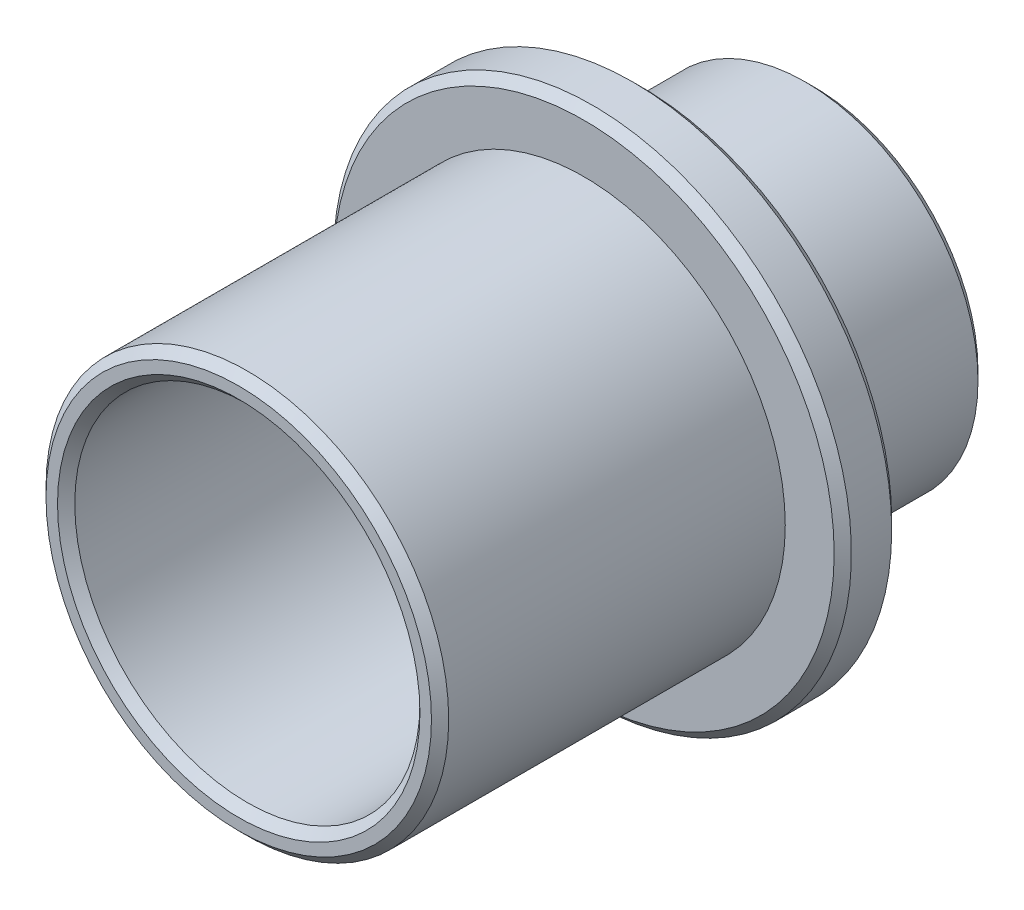
ISO-10303-21;
HEADER;
FILE_DESCRIPTION(('STEP AP214'),'2;1');
FILE_NAME('part.step','',(''),(''),'','','');
FILE_SCHEMA(('AUTOMOTIVE_DESIGN { 1 0 10303 214 1 1 1 1 }'));
ENDSEC;
DATA;
#1=APPLICATION_CONTEXT('core data for automotive mechanical design processes');
#2=APPLICATION_PROTOCOL_DEFINITION('international standard','automotive_design',2000,#1);
#3=PRODUCT_CONTEXT('',#1,'mechanical');
#4=PRODUCT('Part','Part','',(#3));
#5=PRODUCT_RELATED_PRODUCT_CATEGORY('part','',(#4));
#6=PRODUCT_DEFINITION_FORMATION('','',#4);
#7=PRODUCT_DEFINITION_CONTEXT('part definition',#1,'design');
#8=PRODUCT_DEFINITION('design','',#6,#7);
#9=PRODUCT_DEFINITION_SHAPE('','',#8);
#10=(LENGTH_UNIT() NAMED_UNIT(*) SI_UNIT(.MILLI.,.METRE.));
#11=(NAMED_UNIT(*) PLANE_ANGLE_UNIT() SI_UNIT($,.RADIAN.));
#12=(NAMED_UNIT(*) SI_UNIT($,.STERADIAN.) SOLID_ANGLE_UNIT());
#13=UNCERTAINTY_MEASURE_WITH_UNIT(LENGTH_MEASURE(1.E-05),#10,'distance_accuracy_value','');
#14=(GEOMETRIC_REPRESENTATION_CONTEXT(3) GLOBAL_UNCERTAINTY_ASSIGNED_CONTEXT((#13)) GLOBAL_UNIT_ASSIGNED_CONTEXT((#10,
#11,#12)) REPRESENTATION_CONTEXT('',''));
#15=CARTESIAN_POINT('',(0.,0.,0.));
#16=DIRECTION('',(0.,0.,1.));
#17=DIRECTION('',(1.,0.,0.));
#18=AXIS2_PLACEMENT_3D('',#15,#16,#17);
#19=CARTESIAN_POINT('',(0.,0.,0.));
#20=DIRECTION('',(0.,0.,-1.));
#21=DIRECTION('',(-1.,0.,0.));
#22=AXIS2_PLACEMENT_3D('',#19,#20,#21);
#23=PLANE('',#22);
#24=CARTESIAN_POINT('',(0.,0.,0.));
#25=DIRECTION('',(0.,0.,1.));
#26=DIRECTION('',(1.,0.,0.));
#27=AXIS2_PLACEMENT_3D('',#24,#25,#26);
#28=CIRCLE('',#27,4.);
#29=CARTESIAN_POINT('',(4.,0.,0.));
#30=VERTEX_POINT('',#29);
#31=EDGE_CURVE('E17',#30,#30,#28,.F.);
#32=ORIENTED_EDGE('',*,*,#31,.T.);
#33=EDGE_LOOP('',(#32));
#34=FACE_BOUND('',#33,.T.);
#35=ADVANCED_FACE('F14',(#34),#23,.T.);
#36=CARTESIAN_POINT('',(0.,0.,-6.));
#37=DIRECTION('',(0.,0.,1.));
#38=DIRECTION('',(1.,0.,0.));
#39=AXIS2_PLACEMENT_3D('',#36,#37,#38);
#40=CYLINDRICAL_SURFACE('',#39,4.);
#41=CARTESIAN_POINT('',(0.,0.,-5.69999999999027));
#42=DIRECTION('',(0.,0.,-1.));
#43=DIRECTION('',(-1.,0.,0.));
#44=AXIS2_PLACEMENT_3D('',#41,#42,#43);
#45=CIRCLE('',#44,4.0000000000191);
#46=CARTESIAN_POINT('',(-4.0000000000191,0.,-5.69999999999027));
#47=VERTEX_POINT('',#46);
#48=EDGE_CURVE('E35',#47,#47,#45,.T.);
#49=ORIENTED_EDGE('',*,*,#48,.T.);
#50=EDGE_LOOP('',(#49));
#51=FACE_BOUND('',#50,.T.);
#52=ORIENTED_EDGE('',*,*,#31,.F.);
#53=EDGE_LOOP('',(#52));
#54=FACE_BOUND('',#53,.T.);
#55=ADVANCED_FACE('F75',(#51,#54),#40,.F.);
#56=CARTESIAN_POINT('',(0.,0.,-5.99999999997181));
#57=DIRECTION('',(0.,0.,-1.));
#58=DIRECTION('',(-1.,0.,0.));
#59=AXIS2_PLACEMENT_3D('',#56,#57,#58);
#60=CONICAL_SURFACE('',#59,4.30000000000064,0.785398163397448);
#61=ORIENTED_EDGE('',*,*,#48,.F.);
#62=EDGE_LOOP('',(#61));
#63=FACE_BOUND('',#62,.T.);
#64=CARTESIAN_POINT('',(0.,0.,-5.99999999997181));
#65=DIRECTION('',(0.,0.,-1.));
#66=DIRECTION('',(-1.,0.,0.));
#67=AXIS2_PLACEMENT_3D('',#64,#65,#66);
#68=CIRCLE('',#67,4.30000000000064);
#69=CARTESIAN_POINT('',(-4.30000000000064,0.,-5.99999999997181));
#70=VERTEX_POINT('',#69);
#71=EDGE_CURVE('E64',#70,#70,#68,.F.);
#72=ORIENTED_EDGE('',*,*,#71,.F.);
#73=EDGE_LOOP('',(#72));
#74=FACE_BOUND('',#73,.T.);
#75=ADVANCED_FACE('F77',(#63,#74),#60,.F.);
#76=CARTESIAN_POINT('',(0.,0.,-6.));
#77=DIRECTION('',(0.,0.,-1.));
#78=DIRECTION('',(-1.,0.,0.));
#79=AXIS2_PLACEMENT_3D('',#76,#77,#78);
#80=PLANE('',#79);
#81=CARTESIAN_POINT('',(0.,0.,-5.99999999991496));
#82=DIRECTION('',(0.,0.,1.));
#83=DIRECTION('',(1.,0.,0.));
#84=AXIS2_PLACEMENT_3D('',#81,#82,#83);
#85=CIRCLE('',#84,5.70000000004711);
#86=CARTESIAN_POINT('',(5.70000000004711,0.,-5.99999999991496));
#87=VERTEX_POINT('',#86);
#88=EDGE_CURVE('E62',#87,#87,#85,.T.);
#89=ORIENTED_EDGE('',*,*,#88,.F.);
#90=EDGE_LOOP('',(#89));
#91=FACE_BOUND('',#90,.T.);
#92=ORIENTED_EDGE('',*,*,#71,.T.);
#93=EDGE_LOOP('',(#92));
#94=FACE_BOUND('',#93,.T.);
#95=ADVANCED_FACE('F83',(#91,#94),#80,.T.);
#96=CARTESIAN_POINT('',(0.,0.,-5.70000000010396));
#97=DIRECTION('',(0.,0.,1.));
#98=DIRECTION('',(1.,0.,0.));
#99=AXIS2_PLACEMENT_3D('',#96,#97,#98);
#100=CONICAL_SURFACE('',#99,5.99999999991496,0.785398163492187);
#101=CARTESIAN_POINT('',(0.,0.,-5.7));
#102=DIRECTION('',(0.,0.,1.));
#103=DIRECTION('',(1.,0.,0.));
#104=AXIS2_PLACEMENT_3D('',#101,#102,#103);
#105=CIRCLE('',#104,6.);
#106=CARTESIAN_POINT('',(6.,0.,-5.7));
#107=VERTEX_POINT('',#106);
#108=EDGE_CURVE('E61',#107,#107,#105,.T.);
#109=ORIENTED_EDGE('',*,*,#108,.F.);
#110=EDGE_LOOP('',(#109));
#111=FACE_BOUND('',#110,.T.);
#112=ORIENTED_EDGE('',*,*,#88,.T.);
#113=EDGE_LOOP('',(#112));
#114=FACE_BOUND('',#113,.T.);
#115=ADVANCED_FACE('F137',(#111,#114),#100,.T.);
#116=CARTESIAN_POINT('',(0.,0.,-6.));
#117=DIRECTION('',(0.,0.,1.));
#118=DIRECTION('',(1.,0.,0.));
#119=AXIS2_PLACEMENT_3D('',#116,#117,#118);
#120=CYLINDRICAL_SURFACE('',#119,6.);
#121=CARTESIAN_POINT('',(0.,0.,0.));
#122=DIRECTION('',(0.,0.,1.));
#123=DIRECTION('',(1.,0.,0.));
#124=AXIS2_PLACEMENT_3D('',#121,#122,#123);
#125=CIRCLE('',#124,6.);
#126=CARTESIAN_POINT('',(6.,0.,0.));
#127=VERTEX_POINT('',#126);
#128=EDGE_CURVE('E57',#127,#127,#125,.T.);
#129=ORIENTED_EDGE('',*,*,#128,.F.);
#130=EDGE_LOOP('',(#129));
#131=FACE_BOUND('',#130,.T.);
#132=ORIENTED_EDGE('',*,*,#108,.T.);
#133=EDGE_LOOP('',(#132));
#134=FACE_BOUND('',#133,.T.);
#135=ADVANCED_FACE('F133',(#131,#134),#120,.T.);
#136=CARTESIAN_POINT('',(0.,0.,2.));
#137=DIRECTION('',(0.,0.,-1.));
#138=DIRECTION('',(-1.,0.,0.));
#139=AXIS2_PLACEMENT_3D('',#136,#137,#138);
#140=PLANE('',#139);
#141=CARTESIAN_POINT('',(0.,0.,2.));
#142=DIRECTION('',(0.,0.,-1.));
#143=DIRECTION('',(-1.,0.,0.));
#144=AXIS2_PLACEMENT_3D('',#141,#142,#143);
#145=CIRCLE('',#144,6.);
#146=CARTESIAN_POINT('',(-6.,0.,2.));
#147=VERTEX_POINT('',#146);
#148=EDGE_CURVE('E54',#147,#147,#145,.F.);
#149=ORIENTED_EDGE('',*,*,#148,.T.);
#150=EDGE_LOOP('',(#149));
#151=FACE_BOUND('',#150,.T.);
#152=ADVANCED_FACE('F129',(#151),#140,.F.);
#153=CARTESIAN_POINT('',(0.,0.,0.));
#154=DIRECTION('',(0.,0.,-1.));
#155=DIRECTION('',(-1.,0.,0.));
#156=AXIS2_PLACEMENT_3D('',#153,#154,#155);
#157=PLANE('',#156);
#158=ORIENTED_EDGE('',*,*,#128,.T.);
#159=EDGE_LOOP('',(#158));
#160=FACE_BOUND('',#159,.T.);
#161=CARTESIAN_POINT('',(0.,0.,0.));
#162=DIRECTION('',(0.,0.,1.));
#163=DIRECTION('',(1.,0.,0.));
#164=AXIS2_PLACEMENT_3D('',#161,#162,#163);
#165=CIRCLE('',#164,8.69999999999999);
#166=CARTESIAN_POINT('',(8.69999999999999,0.,0.));
#167=VERTEX_POINT('',#166);
#168=EDGE_CURVE('E49',#167,#167,#165,.T.);
#169=ORIENTED_EDGE('',*,*,#168,.F.);
#170=EDGE_LOOP('',(#169));
#171=FACE_BOUND('',#170,.T.);
#172=ADVANCED_FACE('F125',(#160,#171),#157,.T.);
#173=CARTESIAN_POINT('',(0.,0.,14.));
#174=DIRECTION('',(0.,0.,-1.));
#175=DIRECTION('',(-1.,0.,0.));
#176=AXIS2_PLACEMENT_3D('',#173,#174,#175);
#177=CYLINDRICAL_SURFACE('',#176,6.);
#178=CARTESIAN_POINT('',(0.,0.,13.7000000000285));
#179=DIRECTION('',(0.,0.,1.));
#180=DIRECTION('',(1.,0.,0.));
#181=AXIS2_PLACEMENT_3D('',#178,#179,#180);
#182=CIRCLE('',#181,6.00000000002865);
#183=CARTESIAN_POINT('',(6.00000000002865,0.,13.7000000000285));
#184=VERTEX_POINT('',#183);
#185=EDGE_CURVE('E53',#184,#184,#182,.T.);
#186=ORIENTED_EDGE('',*,*,#185,.T.);
#187=EDGE_LOOP('',(#186));
#188=FACE_BOUND('',#187,.T.);
#189=ORIENTED_EDGE('',*,*,#148,.F.);
#190=EDGE_LOOP('',(#189));
#191=FACE_BOUND('',#190,.T.);
#192=ADVANCED_FACE('F122',(#188,#191),#177,.F.);
#193=CARTESIAN_POINT('',(0.,0.,0.300000000000007));
#194=DIRECTION('',(0.,0.,1.));
#195=DIRECTION('',(1.,0.,0.));
#196=AXIS2_PLACEMENT_3D('',#193,#194,#195);
#197=CONICAL_SURFACE('',#196,9.,0.785398163397454);
#198=ORIENTED_EDGE('',*,*,#168,.T.);
#199=EDGE_LOOP('',(#198));
#200=FACE_BOUND('',#199,.T.);
#201=CARTESIAN_POINT('',(0.,0.,0.300000000000007));
#202=DIRECTION('',(0.,0.,-1.));
#203=DIRECTION('',(-1.,0.,0.));
#204=AXIS2_PLACEMENT_3D('',#201,#202,#203);
#205=CIRCLE('',#204,9.);
#206=CARTESIAN_POINT('',(-9.,0.,0.300000000000007));
#207=VERTEX_POINT('',#206);
#208=EDGE_CURVE('E48',#207,#207,#205,.F.);
#209=ORIENTED_EDGE('',*,*,#208,.F.);
#210=EDGE_LOOP('',(#209));
#211=FACE_BOUND('',#210,.T.);
#212=ADVANCED_FACE('F118',(#200,#211),#197,.T.);
#213=CARTESIAN_POINT('',(0.,0.,14.00000000001));
#214=DIRECTION('',(0.,0.,1.));
#215=DIRECTION('',(1.,0.,0.));
#216=AXIS2_PLACEMENT_3D('',#213,#214,#215);
#217=CONICAL_SURFACE('',#216,6.30000000001019,0.785398163397448);
#218=ORIENTED_EDGE('',*,*,#185,.F.);
#219=EDGE_LOOP('',(#218));
#220=FACE_BOUND('',#219,.T.);
#221=CARTESIAN_POINT('',(0.,0.,14.00000000001));
#222=DIRECTION('',(0.,0.,1.));
#223=DIRECTION('',(1.,0.,0.));
#224=AXIS2_PLACEMENT_3D('',#221,#222,#223);
#225=CIRCLE('',#224,6.30000000001019);
#226=CARTESIAN_POINT('',(6.30000000001019,0.,14.00000000001));
#227=VERTEX_POINT('',#226);
#228=EDGE_CURVE('E44',#227,#227,#225,.F.);
#229=ORIENTED_EDGE('',*,*,#228,.F.);
#230=EDGE_LOOP('',(#229));
#231=FACE_BOUND('',#230,.T.);
#232=ADVANCED_FACE('F114',(#220,#231),#217,.F.);
#233=CARTESIAN_POINT('',(0.,0.,14.));
#234=DIRECTION('',(0.,0.,-1.));
#235=DIRECTION('',(-1.,0.,0.));
#236=AXIS2_PLACEMENT_3D('',#233,#234,#235);
#237=CYLINDRICAL_SURFACE('',#236,9.);
#238=CARTESIAN_POINT('',(0.,0.,1.70000000000001));
#239=DIRECTION('',(0.,0.,-1.));
#240=DIRECTION('',(-1.,0.,0.));
#241=AXIS2_PLACEMENT_3D('',#238,#239,#240);
#242=CIRCLE('',#241,9.);
#243=CARTESIAN_POINT('',(-9.,0.,1.70000000000001));
#244=VERTEX_POINT('',#243);
#245=EDGE_CURVE('E43',#244,#244,#242,.F.);
#246=ORIENTED_EDGE('',*,*,#245,.F.);
#247=EDGE_LOOP('',(#246));
#248=FACE_BOUND('',#247,.T.);
#249=ORIENTED_EDGE('',*,*,#208,.T.);
#250=EDGE_LOOP('',(#249));
#251=FACE_BOUND('',#250,.T.);
#252=ADVANCED_FACE('F110',(#248,#251),#237,.T.);
#253=CARTESIAN_POINT('',(0.,0.,14.));
#254=DIRECTION('',(0.,0.,1.));
#255=DIRECTION('',(1.,0.,0.));
#256=AXIS2_PLACEMENT_3D('',#253,#254,#255);
#257=PLANE('',#256);
#258=ORIENTED_EDGE('',*,*,#228,.T.);
#259=EDGE_LOOP('',(#258));
#260=FACE_BOUND('',#259,.T.);
#261=CARTESIAN_POINT('',(0.,0.,14.0000000000668));
#262=DIRECTION('',(0.,0.,-1.));
#263=DIRECTION('',(-1.,0.,0.));
#264=AXIS2_PLACEMENT_3D('',#261,#262,#263);
#265=CIRCLE('',#264,6.69999999996662);
#266=CARTESIAN_POINT('',(-6.69999999996662,0.,14.0000000000668));
#267=VERTEX_POINT('',#266);
#268=EDGE_CURVE('E39',#267,#267,#265,.T.);
#269=ORIENTED_EDGE('',*,*,#268,.F.);
#270=EDGE_LOOP('',(#269));
#271=FACE_BOUND('',#270,.T.);
#272=ADVANCED_FACE('F106',(#260,#271),#257,.T.);
#273=CARTESIAN_POINT('',(0.,0.,1.70000000000001));
#274=DIRECTION('',(0.,0.,-1.));
#275=DIRECTION('',(-1.,0.,0.));
#276=AXIS2_PLACEMENT_3D('',#273,#274,#275);
#277=CONICAL_SURFACE('',#276,9.,0.785398163397451);
#278=CARTESIAN_POINT('',(0.,0.,2.));
#279=DIRECTION('',(0.,0.,-1.));
#280=DIRECTION('',(-1.,0.,0.));
#281=AXIS2_PLACEMENT_3D('',#278,#279,#280);
#282=CIRCLE('',#281,8.7);
#283=CARTESIAN_POINT('',(-8.7,0.,2.));
#284=VERTEX_POINT('',#283);
#285=EDGE_CURVE('E31',#284,#284,#282,.T.);
#286=ORIENTED_EDGE('',*,*,#285,.T.);
#287=EDGE_LOOP('',(#286));
#288=FACE_BOUND('',#287,.T.);
#289=ORIENTED_EDGE('',*,*,#245,.T.);
#290=EDGE_LOOP('',(#289));
#291=FACE_BOUND('',#290,.T.);
#292=ADVANCED_FACE('F102',(#288,#291),#277,.T.);
#293=CARTESIAN_POINT('',(0.,0.,13.7000000000853));
#294=DIRECTION('',(0.,0.,-1.));
#295=DIRECTION('',(-1.,0.,0.));
#296=AXIS2_PLACEMENT_3D('',#293,#294,#295);
#297=CONICAL_SURFACE('',#296,6.99999999994816,0.785398163397448);
#298=CARTESIAN_POINT('',(0.,0.,13.7));
#299=DIRECTION('',(0.,0.,-1.));
#300=DIRECTION('',(-1.,0.,0.));
#301=AXIS2_PLACEMENT_3D('',#298,#299,#300);
#302=CIRCLE('',#301,7.);
#303=CARTESIAN_POINT('',(-7.,0.,13.7));
#304=VERTEX_POINT('',#303);
#305=EDGE_CURVE('E22',#304,#304,#302,.T.);
#306=ORIENTED_EDGE('',*,*,#305,.F.);
#307=EDGE_LOOP('',(#306));
#308=FACE_BOUND('',#307,.T.);
#309=ORIENTED_EDGE('',*,*,#268,.T.);
#310=EDGE_LOOP('',(#309));
#311=FACE_BOUND('',#310,.T.);
#312=ADVANCED_FACE('F95',(#308,#311),#297,.T.);
#313=CARTESIAN_POINT('',(0.,0.,2.));
#314=DIRECTION('',(0.,0.,-1.));
#315=DIRECTION('',(-1.,0.,0.));
#316=AXIS2_PLACEMENT_3D('',#313,#314,#315);
#317=PLANE('',#316);
#318=CARTESIAN_POINT('',(0.,0.,2.));
#319=DIRECTION('',(0.,0.,-1.));
#320=DIRECTION('',(-1.,0.,0.));
#321=AXIS2_PLACEMENT_3D('',#318,#319,#320);
#322=CIRCLE('',#321,7.);
#323=CARTESIAN_POINT('',(-7.,0.,2.));
#324=VERTEX_POINT('',#323);
#325=EDGE_CURVE('E10',#324,#324,#322,.F.);
#326=ORIENTED_EDGE('',*,*,#325,.F.);
#327=EDGE_LOOP('',(#326));
#328=FACE_BOUND('',#327,.T.);
#329=ORIENTED_EDGE('',*,*,#285,.F.);
#330=EDGE_LOOP('',(#329));
#331=FACE_BOUND('',#330,.T.);
#332=ADVANCED_FACE('F89',(#328,#331),#317,.F.);
#333=CARTESIAN_POINT('',(0.,0.,14.));
#334=DIRECTION('',(0.,0.,-1.));
#335=DIRECTION('',(-1.,0.,0.));
#336=AXIS2_PLACEMENT_3D('',#333,#334,#335);
#337=CYLINDRICAL_SURFACE('',#336,7.);
#338=ORIENTED_EDGE('',*,*,#325,.T.);
#339=EDGE_LOOP('',(#338));
#340=FACE_BOUND('',#339,.T.);
#341=ORIENTED_EDGE('',*,*,#305,.T.);
#342=EDGE_LOOP('',(#341));
#343=FACE_BOUND('',#342,.T.);
#344=ADVANCED_FACE('F87',(#340,#343),#337,.T.);
#345=CLOSED_SHELL('',(#35,#55,#75,#95,#115,#135,#152,#172,#192,#212,#232,#252,#272,#292,#312,
#332,#344));
#346=MANIFOLD_SOLID_BREP('B1',#345);
#347=ADVANCED_BREP_SHAPE_REPRESENTATION('',(#18,#346),#14);
#348=SHAPE_DEFINITION_REPRESENTATION(#9,#347);
ENDSEC;
END-ISO-10303-21;
